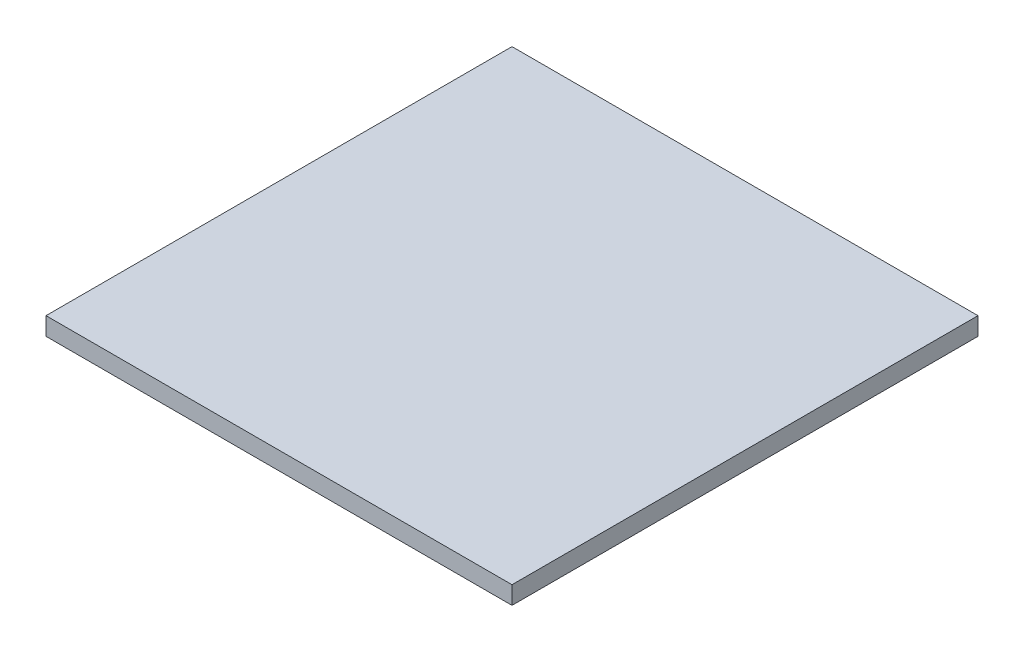
ISO-10303-21;
HEADER;
FILE_DESCRIPTION(('STEP AP214'),'2;1');
FILE_NAME('part.step','',(''),(''),'','','');
FILE_SCHEMA(('AUTOMOTIVE_DESIGN { 1 0 10303 214 1 1 1 1 }'));
ENDSEC;
DATA;
#1=APPLICATION_CONTEXT('core data for automotive mechanical design processes');
#2=APPLICATION_PROTOCOL_DEFINITION('international standard','automotive_design',2000,#1);
#3=PRODUCT_CONTEXT('',#1,'mechanical');
#4=PRODUCT('Part','Part','',(#3));
#5=PRODUCT_RELATED_PRODUCT_CATEGORY('part','',(#4));
#6=PRODUCT_DEFINITION_FORMATION('','',#4);
#7=PRODUCT_DEFINITION_CONTEXT('part definition',#1,'design');
#8=PRODUCT_DEFINITION('design','',#6,#7);
#9=PRODUCT_DEFINITION_SHAPE('','',#8);
#10=(LENGTH_UNIT() NAMED_UNIT(*) SI_UNIT(.MILLI.,.METRE.));
#11=(NAMED_UNIT(*) PLANE_ANGLE_UNIT() SI_UNIT($,.RADIAN.));
#12=(NAMED_UNIT(*) SI_UNIT($,.STERADIAN.) SOLID_ANGLE_UNIT());
#13=UNCERTAINTY_MEASURE_WITH_UNIT(LENGTH_MEASURE(1.E-05),#10,'distance_accuracy_value','');
#14=(GEOMETRIC_REPRESENTATION_CONTEXT(3) GLOBAL_UNCERTAINTY_ASSIGNED_CONTEXT((#13)) GLOBAL_UNIT_ASSIGNED_CONTEXT((#10,
#11,#12)) REPRESENTATION_CONTEXT('',''));
#15=CARTESIAN_POINT('',(0.,0.,0.));
#16=DIRECTION('',(0.,0.,1.));
#17=DIRECTION('',(1.,0.,0.));
#18=AXIS2_PLACEMENT_3D('',#15,#16,#17);
#19=CARTESIAN_POINT('',(-4160.,320.,4160.));
#20=DIRECTION('',(1.,0.,0.));
#21=DIRECTION('',(0.,0.,-1.));
#22=AXIS2_PLACEMENT_3D('',#19,#20,#21);
#23=PLANE('',#22);
#24=DIRECTION('',(0.,0.,1.));
#25=VECTOR('',#24,1.);
#26=CARTESIAN_POINT('',(-4160.,0.,4160.));
#27=LINE('',#26,#25);
#28=CARTESIAN_POINT('',(-4160.,0.,-4160.));
#29=VERTEX_POINT('',#28);
#30=CARTESIAN_POINT('',(-4160.,0.,4160.));
#31=VERTEX_POINT('',#30);
#32=EDGE_CURVE('E102',#29,#31,#27,.T.);
#33=ORIENTED_EDGE('',*,*,#32,.T.);
#34=DIRECTION('',(0.,-1.,0.));
#35=VECTOR('',#34,1.);
#36=CARTESIAN_POINT('',(-4160.,320.,4160.));
#37=LINE('',#36,#35);
#38=CARTESIAN_POINT('',(-4160.,320.,4160.));
#39=VERTEX_POINT('',#38);
#40=EDGE_CURVE('E11',#39,#31,#37,.T.);
#41=ORIENTED_EDGE('',*,*,#40,.F.);
#42=DIRECTION('',(0.,0.,1.));
#43=VECTOR('',#42,1.);
#44=CARTESIAN_POINT('',(-4160.,320.,4160.));
#45=LINE('',#44,#43);
#46=CARTESIAN_POINT('',(-4160.,320.,-4160.));
#47=VERTEX_POINT('',#46);
#48=EDGE_CURVE('E90',#47,#39,#45,.T.);
#49=ORIENTED_EDGE('',*,*,#48,.F.);
#50=DIRECTION('',(0.,-1.,0.));
#51=VECTOR('',#50,1.);
#52=CARTESIAN_POINT('',(-4160.,320.,-4160.));
#53=LINE('',#52,#51);
#54=EDGE_CURVE('E98',#47,#29,#53,.T.);
#55=ORIENTED_EDGE('',*,*,#54,.T.);
#56=EDGE_LOOP('',(#33,#41,#49,#55));
#57=FACE_BOUND('',#56,.T.);
#58=ADVANCED_FACE('F39',(#57),#23,.F.);
#59=CARTESIAN_POINT('',(4160.,320.,4160.));
#60=DIRECTION('',(0.,0.,-1.));
#61=DIRECTION('',(-1.,0.,0.));
#62=AXIS2_PLACEMENT_3D('',#59,#60,#61);
#63=PLANE('',#62);
#64=DIRECTION('',(1.,0.,0.));
#65=VECTOR('',#64,1.);
#66=CARTESIAN_POINT('',(4160.,0.,4160.));
#67=LINE('',#66,#65);
#68=CARTESIAN_POINT('',(4160.,0.,4160.));
#69=VERTEX_POINT('',#68);
#70=EDGE_CURVE('E94',#31,#69,#67,.T.);
#71=ORIENTED_EDGE('',*,*,#70,.T.);
#72=DIRECTION('',(0.,-1.,0.));
#73=VECTOR('',#72,1.);
#74=CARTESIAN_POINT('',(4160.,320.,4160.));
#75=LINE('',#74,#73);
#76=CARTESIAN_POINT('',(4160.,320.,4160.));
#77=VERTEX_POINT('',#76);
#78=EDGE_CURVE('E47',#77,#69,#75,.T.);
#79=ORIENTED_EDGE('',*,*,#78,.F.);
#80=DIRECTION('',(1.,0.,0.));
#81=VECTOR('',#80,1.);
#82=CARTESIAN_POINT('',(4160.,320.,4160.));
#83=LINE('',#82,#81);
#84=EDGE_CURVE('E85',#39,#77,#83,.T.);
#85=ORIENTED_EDGE('',*,*,#84,.F.);
#86=ORIENTED_EDGE('',*,*,#40,.T.);
#87=EDGE_LOOP('',(#71,#79,#85,#86));
#88=FACE_BOUND('',#87,.T.);
#89=ADVANCED_FACE('F93',(#88),#63,.F.);
#90=CARTESIAN_POINT('',(4160.,320.,4160.));
#91=DIRECTION('',(-1.,0.,0.));
#92=DIRECTION('',(0.,0.,1.));
#93=AXIS2_PLACEMENT_3D('',#90,#91,#92);
#94=PLANE('',#93);
#95=DIRECTION('',(0.,0.,-1.));
#96=VECTOR('',#95,1.);
#97=CARTESIAN_POINT('',(4160.,0.,4160.));
#98=LINE('',#97,#96);
#99=CARTESIAN_POINT('',(4160.,0.,-4160.));
#100=VERTEX_POINT('',#99);
#101=EDGE_CURVE('E72',#69,#100,#98,.T.);
#102=ORIENTED_EDGE('',*,*,#101,.T.);
#103=DIRECTION('',(0.,-1.,0.));
#104=VECTOR('',#103,1.);
#105=CARTESIAN_POINT('',(4160.,320.,-4160.));
#106=LINE('',#105,#104);
#107=CARTESIAN_POINT('',(4160.,320.,-4160.));
#108=VERTEX_POINT('',#107);
#109=EDGE_CURVE('E95',#108,#100,#106,.T.);
#110=ORIENTED_EDGE('',*,*,#109,.F.);
#111=DIRECTION('',(0.,0.,-1.));
#112=VECTOR('',#111,1.);
#113=CARTESIAN_POINT('',(4160.,320.,4160.));
#114=LINE('',#113,#112);
#115=EDGE_CURVE('E88',#77,#108,#114,.T.);
#116=ORIENTED_EDGE('',*,*,#115,.F.);
#117=ORIENTED_EDGE('',*,*,#78,.T.);
#118=EDGE_LOOP('',(#102,#110,#116,#117));
#119=FACE_BOUND('',#118,.T.);
#120=ADVANCED_FACE('F96',(#119),#94,.F.);
#121=CARTESIAN_POINT('',(4160.,320.,-4160.));
#122=DIRECTION('',(0.,0.,1.));
#123=DIRECTION('',(1.,0.,0.));
#124=AXIS2_PLACEMENT_3D('',#121,#122,#123);
#125=PLANE('',#124);
#126=DIRECTION('',(-1.,0.,0.));
#127=VECTOR('',#126,1.);
#128=CARTESIAN_POINT('',(4160.,0.,-4160.));
#129=LINE('',#128,#127);
#130=EDGE_CURVE('E78',#100,#29,#129,.T.);
#131=ORIENTED_EDGE('',*,*,#130,.T.);
#132=ORIENTED_EDGE('',*,*,#54,.F.);
#133=DIRECTION('',(-1.,0.,0.));
#134=VECTOR('',#133,1.);
#135=CARTESIAN_POINT('',(4160.,320.,-4160.));
#136=LINE('',#135,#134);
#137=EDGE_CURVE('E55',#108,#47,#136,.T.);
#138=ORIENTED_EDGE('',*,*,#137,.F.);
#139=ORIENTED_EDGE('',*,*,#109,.T.);
#140=EDGE_LOOP('',(#131,#132,#138,#139));
#141=FACE_BOUND('',#140,.T.);
#142=ADVANCED_FACE('F109',(#141),#125,.F.);
#143=CARTESIAN_POINT('',(0.,320.,0.));
#144=DIRECTION('',(0.,1.,0.));
#145=DIRECTION('',(0.,0.,1.));
#146=AXIS2_PLACEMENT_3D('',#143,#144,#145);
#147=PLANE('',#146);
#148=ORIENTED_EDGE('',*,*,#48,.T.);
#149=ORIENTED_EDGE('',*,*,#84,.T.);
#150=ORIENTED_EDGE('',*,*,#115,.T.);
#151=ORIENTED_EDGE('',*,*,#137,.T.);
#152=EDGE_LOOP('',(#148,#149,#150,#151));
#153=FACE_BOUND('',#152,.T.);
#154=ADVANCED_FACE('F86',(#153),#147,.T.);
#155=CARTESIAN_POINT('',(0.,0.,0.));
#156=DIRECTION('',(0.,1.,0.));
#157=DIRECTION('',(0.,0.,1.));
#158=AXIS2_PLACEMENT_3D('',#155,#156,#157);
#159=PLANE('',#158);
#160=ORIENTED_EDGE('',*,*,#32,.F.);
#161=ORIENTED_EDGE('',*,*,#130,.F.);
#162=ORIENTED_EDGE('',*,*,#101,.F.);
#163=ORIENTED_EDGE('',*,*,#70,.F.);
#164=EDGE_LOOP('',(#160,#161,#162,#163));
#165=FACE_BOUND('',#164,.T.);
#166=ADVANCED_FACE('F112',(#165),#159,.F.);
#167=CLOSED_SHELL('',(#58,#89,#120,#142,#154,#166));
#168=MANIFOLD_SOLID_BREP('B2',#167);
#169=ADVANCED_BREP_SHAPE_REPRESENTATION('',(#18,#168),#14);
#170=SHAPE_DEFINITION_REPRESENTATION(#9,#169);
ENDSEC;
END-ISO-10303-21;
